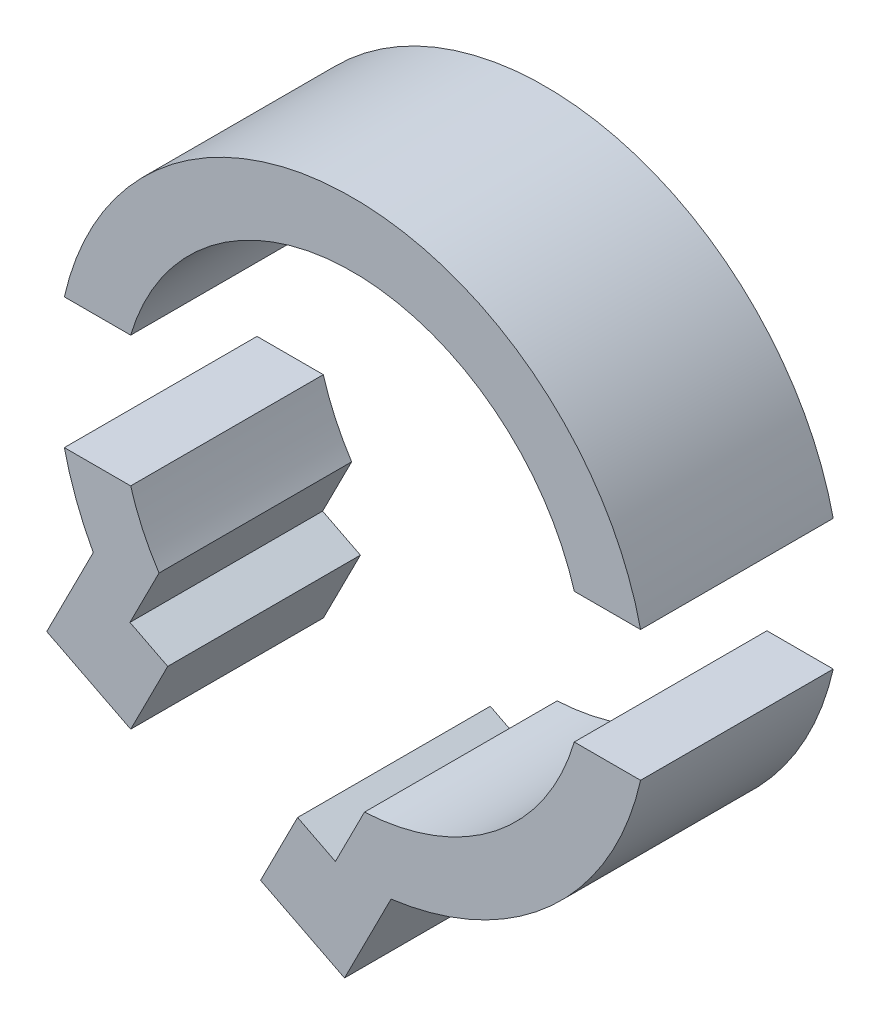
ISO-10303-21;
HEADER;
FILE_DESCRIPTION(('STEP AP214'),'2;1');
FILE_NAME('part.step','',(''),(''),'','','');
FILE_SCHEMA(('AUTOMOTIVE_DESIGN { 1 0 10303 214 1 1 1 1 }'));
ENDSEC;
DATA;
#1=APPLICATION_CONTEXT('core data for automotive mechanical design processes');
#2=APPLICATION_PROTOCOL_DEFINITION('international standard','automotive_design',2000,#1);
#3=PRODUCT_CONTEXT('',#1,'mechanical');
#4=PRODUCT('Part','Part','',(#3));
#5=PRODUCT_RELATED_PRODUCT_CATEGORY('part','',(#4));
#6=PRODUCT_DEFINITION_FORMATION('','',#4);
#7=PRODUCT_DEFINITION_CONTEXT('part definition',#1,'design');
#8=PRODUCT_DEFINITION('design','',#6,#7);
#9=PRODUCT_DEFINITION_SHAPE('','',#8);
#10=(LENGTH_UNIT() NAMED_UNIT(*) SI_UNIT(.MILLI.,.METRE.));
#11=(NAMED_UNIT(*) PLANE_ANGLE_UNIT() SI_UNIT($,.RADIAN.));
#12=(NAMED_UNIT(*) SI_UNIT($,.STERADIAN.) SOLID_ANGLE_UNIT());
#13=UNCERTAINTY_MEASURE_WITH_UNIT(LENGTH_MEASURE(1.E-05),#10,'distance_accuracy_value','');
#14=(GEOMETRIC_REPRESENTATION_CONTEXT(3) GLOBAL_UNCERTAINTY_ASSIGNED_CONTEXT((#13)) GLOBAL_UNIT_ASSIGNED_CONTEXT((#10,
#11,#12)) REPRESENTATION_CONTEXT('',''));
#15=CARTESIAN_POINT('',(0.,0.,0.));
#16=DIRECTION('',(0.,0.,1.));
#17=DIRECTION('',(1.,0.,0.));
#18=AXIS2_PLACEMENT_3D('',#15,#16,#17);
#19=CARTESIAN_POINT('',(-23.8013991895953,-18.1678851822026,15.));
#20=DIRECTION('',(0.452641250539144,0.89169271518296,0.));
#21=DIRECTION('',(-0.89169271518296,0.452641250539144,0.));
#22=AXIS2_PLACEMENT_3D('',#19,#20,#21);
#23=PLANE('',#22);
#24=DIRECTION('',(0.,0.,-1.));
#25=VECTOR('',#24,1.);
#26=CARTESIAN_POINT('',(-17.2652915873042,-21.4857455486545,21.));
#27=LINE('',#26,#25);
#28=CARTESIAN_POINT('',(-17.2652915873042,-21.4857455486545,15.));
#29=VERTEX_POINT('',#28);
#30=CARTESIAN_POINT('',(-17.2652915873042,-21.4857455486545,0.));
#31=VERTEX_POINT('',#30);
#32=EDGE_CURVE('E12',#29,#31,#27,.T.);
#33=ORIENTED_EDGE('',*,*,#32,.F.);
#34=DIRECTION('',(0.89169271518296,-0.452641250539144,0.));
#35=VECTOR('',#34,1.);
#36=CARTESIAN_POINT('',(-23.8013991895953,-18.1678851822026,15.));
#37=LINE('',#36,#35);
#38=CARTESIAN_POINT('',(-23.8013991895953,-18.1678851822026,15.));
#39=VERTEX_POINT('',#38);
#40=EDGE_CURVE('E143',#39,#29,#37,.T.);
#41=ORIENTED_EDGE('',*,*,#40,.F.);
#42=DIRECTION('',(0.,0.,-1.));
#43=VECTOR('',#42,1.);
#44=CARTESIAN_POINT('',(-23.8013991895953,-18.1678851822026,15.));
#45=LINE('',#44,#43);
#46=CARTESIAN_POINT('',(-23.8013991895953,-18.1678851822026,0.));
#47=VERTEX_POINT('',#46);
#48=EDGE_CURVE('E150',#39,#47,#45,.T.);
#49=ORIENTED_EDGE('',*,*,#48,.T.);
#50=DIRECTION('',(0.89169271518296,-0.452641250539144,0.));
#51=VECTOR('',#50,1.);
#52=CARTESIAN_POINT('',(-23.8013991895953,-18.1678851822026,0.));
#53=LINE('',#52,#51);
#54=EDGE_CURVE('E146',#47,#31,#53,.T.);
#55=ORIENTED_EDGE('',*,*,#54,.T.);
#56=EDGE_LOOP('',(#33,#41,#49,#55));
#57=FACE_BOUND('',#56,.T.);
#58=ADVANCED_FACE('F50',(#57),#23,.F.);
#59=CARTESIAN_POINT('',(0.,0.,0.));
#60=DIRECTION('',(0.,0.,1.));
#61=DIRECTION('',(1.,0.,0.));
#62=AXIS2_PLACEMENT_3D('',#59,#60,#61);
#63=PLANE('',#62);
#64=DIRECTION('',(-0.452641250539145,-0.89169271518296,0.));
#65=VECTOR('',#64,1.);
#66=CARTESIAN_POINT('',(-17.2652915873042,-21.4857455486545,0.));
#67=LINE('',#66,#65);
#68=CARTESIAN_POINT('',(-14.3829053131814,-15.8075117599372,0.));
#69=VERTEX_POINT('',#68);
#70=EDGE_CURVE('E149',#69,#31,#67,.T.);
#71=ORIENTED_EDGE('',*,*,#70,.T.);
#72=ORIENTED_EDGE('',*,*,#54,.F.);
#73=DIRECTION('',(-0.452641250539145,-0.89169271518296,0.));
#74=VECTOR('',#73,1.);
#75=CARTESIAN_POINT('',(-23.8013991895953,-18.1678851822026,0.));
#76=LINE('',#75,#74);
#77=CARTESIAN_POINT('',(-20.1802691852822,-11.0343434607389,0.));
#78=VERTEX_POINT('',#77);
#79=EDGE_CURVE('E172',#78,#47,#76,.T.);
#80=ORIENTED_EDGE('',*,*,#79,.F.);
#81=CARTESIAN_POINT('',(0.,0.,0.));
#82=DIRECTION('',(0.,0.,1.));
#83=DIRECTION('',(1.,0.,0.));
#84=AXIS2_PLACEMENT_3D('',#81,#82,#83);
#85=CIRCLE('',#84,23.);
#86=CARTESIAN_POINT('',(-22.4317131974113,-5.08116551876451,0.));
#87=VERTEX_POINT('',#86);
#88=EDGE_CURVE('E136',#87,#78,#85,.T.);
#89=ORIENTED_EDGE('',*,*,#88,.F.);
#90=DIRECTION('',(1.,0.,0.));
#91=VECTOR('',#90,1.);
#92=CARTESIAN_POINT('',(-27.3645817818939,-5.08116551876451,0.));
#93=LINE('',#92,#91);
#94=CARTESIAN_POINT('',(-17.2679401484635,-5.08116551876451,0.));
#95=VERTEX_POINT('',#94);
#96=EDGE_CURVE('E53',#87,#95,#93,.T.);
#97=ORIENTED_EDGE('',*,*,#96,.T.);
#98=CARTESIAN_POINT('',(0.,0.,0.));
#99=DIRECTION('',(0.,0.,1.));
#100=DIRECTION('',(1.,0.,0.));
#101=AXIS2_PLACEMENT_3D('',#98,#99,#100);
#102=CIRCLE('',#101,18.);
#103=CARTESIAN_POINT('',(-15.0622850205895,-9.85533205724319,0.));
#104=VERTEX_POINT('',#103);
#105=EDGE_CURVE('E127',#95,#104,#102,.T.);
#106=ORIENTED_EDGE('',*,*,#105,.T.);
#107=DIRECTION('',(-0.452641250539143,-0.891692715182961,0.));
#108=VECTOR('',#107,1.);
#109=CARTESIAN_POINT('',(-15.0622850205895,-9.85533205724319,0.));
#110=LINE('',#109,#108);
#111=CARTESIAN_POINT('',(-17.3254912732852,-14.313795633158,0.));
#112=VERTEX_POINT('',#111);
#113=EDGE_CURVE('E142',#104,#112,#110,.T.);
#114=ORIENTED_EDGE('',*,*,#113,.T.);
#115=DIRECTION('',(0.89169271518296,-0.452641250539144,0.));
#116=VECTOR('',#115,1.);
#117=CARTESIAN_POINT('',(-17.3254912732852,-14.313795633158,0.));
#118=LINE('',#117,#116);
#119=EDGE_CURVE('E145',#112,#69,#118,.T.);
#120=ORIENTED_EDGE('',*,*,#119,.T.);
#121=EDGE_LOOP('',(#71,#72,#80,#89,#97,#106,#114,#120));
#122=FACE_BOUND('',#121,.T.);
#123=ADVANCED_FACE('F202',(#122),#63,.F.);
#124=CARTESIAN_POINT('',(0.,0.,15.));
#125=DIRECTION('',(0.,0.,1.));
#126=DIRECTION('',(1.,0.,0.));
#127=AXIS2_PLACEMENT_3D('',#124,#125,#126);
#128=PLANE('',#127);
#129=ORIENTED_EDGE('',*,*,#40,.T.);
#130=DIRECTION('',(0.452641250539145,0.89169271518296,0.));
#131=VECTOR('',#130,1.);
#132=CARTESIAN_POINT('',(-5.05589769508736,2.56647589055694,15.));
#133=LINE('',#132,#131);
#134=CARTESIAN_POINT('',(-14.3829053131814,-15.8075117599372,15.));
#135=VERTEX_POINT('',#134);
#136=EDGE_CURVE('E65',#29,#135,#133,.T.);
#137=ORIENTED_EDGE('',*,*,#136,.T.);
#138=DIRECTION('',(-0.89169271518296,0.452641250539144,0.));
#139=VECTOR('',#138,1.);
#140=CARTESIAN_POINT('',(-9.32700761809406,-18.3739876504941,15.));
#141=LINE('',#140,#139);
#142=CARTESIAN_POINT('',(-17.3254912732852,-14.313795633158,15.));
#143=VERTEX_POINT('',#142);
#144=EDGE_CURVE('E151',#135,#143,#141,.T.);
#145=ORIENTED_EDGE('',*,*,#144,.T.);
#146=DIRECTION('',(0.452641250539143,0.891692715182961,0.));
#147=VECTOR('',#146,1.);
#148=CARTESIAN_POINT('',(-7.99848365519117,4.06019201733612,15.));
#149=LINE('',#148,#147);
#150=CARTESIAN_POINT('',(-15.0622850205895,-9.85533205724319,15.));
#151=VERTEX_POINT('',#150);
#152=EDGE_CURVE('E120',#143,#151,#149,.T.);
#153=ORIENTED_EDGE('',*,*,#152,.T.);
#154=CARTESIAN_POINT('',(0.,0.,15.));
#155=DIRECTION('',(0.,0.,1.));
#156=DIRECTION('',(1.,0.,0.));
#157=AXIS2_PLACEMENT_3D('',#154,#155,#156);
#158=CIRCLE('',#157,18.);
#159=CARTESIAN_POINT('',(-17.2679401484635,-5.08116551876451,15.));
#160=VERTEX_POINT('',#159);
#161=EDGE_CURVE('E125',#160,#151,#158,.T.);
#162=ORIENTED_EDGE('',*,*,#161,.F.);
#163=DIRECTION('',(-1.,0.,0.));
#164=VECTOR('',#163,1.);
#165=CARTESIAN_POINT('',(0.,-5.08116551876451,15.));
#166=LINE('',#165,#164);
#167=CARTESIAN_POINT('',(-22.4317131974114,-5.08116551876451,15.));
#168=VERTEX_POINT('',#167);
#169=EDGE_CURVE('E110',#160,#168,#166,.T.);
#170=ORIENTED_EDGE('',*,*,#169,.T.);
#171=CARTESIAN_POINT('',(0.,0.,15.));
#172=DIRECTION('',(0.,0.,1.));
#173=DIRECTION('',(1.,0.,0.));
#174=AXIS2_PLACEMENT_3D('',#171,#172,#173);
#175=CIRCLE('',#174,23.);
#176=CARTESIAN_POINT('',(-20.1802691852822,-11.0343434607389,15.));
#177=VERTEX_POINT('',#176);
#178=EDGE_CURVE('E119',#168,#177,#175,.T.);
#179=ORIENTED_EDGE('',*,*,#178,.T.);
#180=DIRECTION('',(-0.452641250539145,-0.89169271518296,0.));
#181=VECTOR('',#180,1.);
#182=CARTESIAN_POINT('',(-23.8013991895953,-18.1678851822026,15.));
#183=LINE('',#182,#181);
#184=EDGE_CURVE('E164',#177,#39,#183,.T.);
#185=ORIENTED_EDGE('',*,*,#184,.T.);
#186=EDGE_LOOP('',(#129,#137,#145,#153,#162,#170,#179,#185));
#187=FACE_BOUND('',#186,.T.);
#188=ADVANCED_FACE('F132',(#187),#128,.T.);
#189=CARTESIAN_POINT('',(-15.7408290647989,-18.4825899054861,21.));
#190=DIRECTION('',(0.891692715182961,-0.452641250539142,0.));
#191=DIRECTION('',(0.452641250539142,0.891692715182961,0.));
#192=AXIS2_PLACEMENT_3D('',#189,#190,#191);
#193=PLANE('',#192);
#194=DIRECTION('',(0.,0.,-1.));
#195=VECTOR('',#194,1.);
#196=CARTESIAN_POINT('',(-14.3829053131814,-15.8075117599372,21.));
#197=LINE('',#196,#195);
#198=EDGE_CURVE('E167',#135,#69,#197,.T.);
#199=ORIENTED_EDGE('',*,*,#198,.F.);
#200=ORIENTED_EDGE('',*,*,#136,.F.);
#201=ORIENTED_EDGE('',*,*,#32,.T.);
#202=ORIENTED_EDGE('',*,*,#70,.F.);
#203=EDGE_LOOP('',(#199,#200,#201,#202));
#204=FACE_BOUND('',#203,.T.);
#205=ADVANCED_FACE('F183',(#204),#193,.T.);
#206=CARTESIAN_POINT('',(-17.3254912732852,-14.313795633158,21.));
#207=DIRECTION('',(0.452641250539144,0.89169271518296,0.));
#208=DIRECTION('',(-0.89169271518296,0.452641250539144,0.));
#209=AXIS2_PLACEMENT_3D('',#206,#207,#208);
#210=PLANE('',#209);
#211=ORIENTED_EDGE('',*,*,#144,.F.);
#212=ORIENTED_EDGE('',*,*,#198,.T.);
#213=ORIENTED_EDGE('',*,*,#119,.F.);
#214=DIRECTION('',(0.,0.,-1.));
#215=VECTOR('',#214,1.);
#216=CARTESIAN_POINT('',(-17.3254912732852,-14.313795633158,21.));
#217=LINE('',#216,#215);
#218=EDGE_CURVE('E128',#143,#112,#217,.T.);
#219=ORIENTED_EDGE('',*,*,#218,.F.);
#220=EDGE_LOOP('',(#211,#212,#213,#219));
#221=FACE_BOUND('',#220,.T.);
#222=ADVANCED_FACE('F186',(#221),#210,.T.);
#223=CARTESIAN_POINT('',(-23.8013991895953,-18.1678851822026,15.));
#224=DIRECTION('',(0.89169271518296,-0.452641250539145,0.));
#225=DIRECTION('',(0.452641250539145,0.89169271518296,0.));
#226=AXIS2_PLACEMENT_3D('',#223,#224,#225);
#227=PLANE('',#226);
#228=ORIENTED_EDGE('',*,*,#79,.T.);
#229=ORIENTED_EDGE('',*,*,#48,.F.);
#230=ORIENTED_EDGE('',*,*,#184,.F.);
#231=DIRECTION('',(0.,0.,-1.));
#232=VECTOR('',#231,1.);
#233=CARTESIAN_POINT('',(-20.1802691852821,-11.0343434607389,15.));
#234=LINE('',#233,#232);
#235=EDGE_CURVE('E177',#177,#78,#234,.T.);
#236=ORIENTED_EDGE('',*,*,#235,.T.);
#237=EDGE_LOOP('',(#228,#229,#230,#236));
#238=FACE_BOUND('',#237,.T.);
#239=ADVANCED_FACE('F190',(#238),#227,.F.);
#240=CARTESIAN_POINT('',(-15.0622850205895,-9.85533205724319,21.));
#241=DIRECTION('',(0.891692715182961,-0.452641250539143,0.));
#242=DIRECTION('',(0.452641250539143,0.891692715182961,0.));
#243=AXIS2_PLACEMENT_3D('',#240,#241,#242);
#244=PLANE('',#243);
#245=ORIENTED_EDGE('',*,*,#218,.T.);
#246=ORIENTED_EDGE('',*,*,#113,.F.);
#247=DIRECTION('',(0.,0.,-1.));
#248=VECTOR('',#247,1.);
#249=CARTESIAN_POINT('',(-15.0622850205895,-9.85533205724319,15.));
#250=LINE('',#249,#248);
#251=EDGE_CURVE('E134',#151,#104,#250,.T.);
#252=ORIENTED_EDGE('',*,*,#251,.F.);
#253=ORIENTED_EDGE('',*,*,#152,.F.);
#254=EDGE_LOOP('',(#245,#246,#252,#253));
#255=FACE_BOUND('',#254,.T.);
#256=ADVANCED_FACE('F188',(#255),#244,.T.);
#257=CARTESIAN_POINT('',(0.,0.,15.));
#258=DIRECTION('',(0.,0.,-1.));
#259=DIRECTION('',(-1.,0.,0.));
#260=AXIS2_PLACEMENT_3D('',#257,#258,#259);
#261=CYLINDRICAL_SURFACE('',#260,18.);
#262=ORIENTED_EDGE('',*,*,#105,.F.);
#263=DIRECTION('',(0.,0.,-1.));
#264=VECTOR('',#263,1.);
#265=CARTESIAN_POINT('',(-17.2679401484635,-5.08116551876451,15.));
#266=LINE('',#265,#264);
#267=EDGE_CURVE('E113',#95,#160,#266,.F.);
#268=ORIENTED_EDGE('',*,*,#267,.T.);
#269=ORIENTED_EDGE('',*,*,#161,.T.);
#270=ORIENTED_EDGE('',*,*,#251,.T.);
#271=EDGE_LOOP('',(#262,#268,#269,#270));
#272=FACE_BOUND('',#271,.T.);
#273=ADVANCED_FACE('F123',(#272),#261,.F.);
#274=CARTESIAN_POINT('',(0.,0.,15.));
#275=DIRECTION('',(0.,0.,-1.));
#276=DIRECTION('',(-1.,0.,0.));
#277=AXIS2_PLACEMENT_3D('',#274,#275,#276);
#278=CYLINDRICAL_SURFACE('',#277,23.);
#279=DIRECTION('',(0.,0.,-1.));
#280=VECTOR('',#279,1.);
#281=CARTESIAN_POINT('',(-22.4317131974114,-5.08116551876451,15.));
#282=LINE('',#281,#280);
#283=EDGE_CURVE('E59',#87,#168,#282,.F.);
#284=ORIENTED_EDGE('',*,*,#283,.F.);
#285=ORIENTED_EDGE('',*,*,#88,.T.);
#286=ORIENTED_EDGE('',*,*,#235,.F.);
#287=ORIENTED_EDGE('',*,*,#178,.F.);
#288=EDGE_LOOP('',(#284,#285,#286,#287));
#289=FACE_BOUND('',#288,.T.);
#290=ADVANCED_FACE('F196',(#289),#278,.T.);
#291=CARTESIAN_POINT('',(-27.3645817818939,-5.08116551876451,21.));
#292=DIRECTION('',(0.,1.,0.));
#293=DIRECTION('',(-1.,0.,0.));
#294=AXIS2_PLACEMENT_3D('',#291,#292,#293);
#295=PLANE('',#294);
#296=ORIENTED_EDGE('',*,*,#283,.T.);
#297=ORIENTED_EDGE('',*,*,#169,.F.);
#298=ORIENTED_EDGE('',*,*,#267,.F.);
#299=ORIENTED_EDGE('',*,*,#96,.F.);
#300=EDGE_LOOP('',(#296,#297,#298,#299));
#301=FACE_BOUND('',#300,.T.);
#302=ADVANCED_FACE('F112',(#301),#295,.T.);
#303=CLOSED_SHELL('',(#58,#123,#188,#205,#222,#239,#256,#273,#290,#302));
#304=MANIFOLD_SOLID_BREP('B2',#303);
#305=CARTESIAN_POINT('',(0.,0.,15.));
#306=DIRECTION('',(0.,0.,1.));
#307=DIRECTION('',(1.,0.,0.));
#308=AXIS2_PLACEMENT_3D('',#305,#306,#307);
#309=PLANE('',#308);
#310=CARTESIAN_POINT('',(0.,0.,15.));
#311=DIRECTION('',(0.,0.,1.));
#312=DIRECTION('',(1.,0.,0.));
#313=AXIS2_PLACEMENT_3D('',#310,#311,#312);
#314=CIRCLE('',#313,23.);
#315=CARTESIAN_POINT('',(22.4317131974114,5.08116551876451,15.));
#316=VERTEX_POINT('',#315);
#317=CARTESIAN_POINT('',(-22.4317131974114,5.08116551876451,15.));
#318=VERTEX_POINT('',#317);
#319=EDGE_CURVE('E369',#316,#318,#314,.T.);
#320=ORIENTED_EDGE('',*,*,#319,.T.);
#321=DIRECTION('',(1.,0.,0.));
#322=VECTOR('',#321,1.);
#323=CARTESIAN_POINT('',(0.,5.08116551876451,15.));
#324=LINE('',#323,#322);
#325=CARTESIAN_POINT('',(-17.2679401484635,5.08116551876451,15.));
#326=VERTEX_POINT('',#325);
#327=EDGE_CURVE('E320',#318,#326,#324,.T.);
#328=ORIENTED_EDGE('',*,*,#327,.T.);
#329=CARTESIAN_POINT('',(0.,0.,15.));
#330=DIRECTION('',(0.,0.,1.));
#331=DIRECTION('',(1.,0.,0.));
#332=AXIS2_PLACEMENT_3D('',#329,#330,#331);
#333=CIRCLE('',#332,18.);
#334=CARTESIAN_POINT('',(17.2679401484635,5.08116551876451,15.));
#335=VERTEX_POINT('',#334);
#336=EDGE_CURVE('E356',#335,#326,#333,.T.);
#337=ORIENTED_EDGE('',*,*,#336,.F.);
#338=EDGE_CURVE('E341',#335,#316,#324,.T.);
#339=ORIENTED_EDGE('',*,*,#338,.T.);
#340=EDGE_LOOP('',(#320,#328,#337,#339));
#341=FACE_BOUND('',#340,.T.);
#342=ADVANCED_FACE('F302',(#341),#309,.T.);
#343=CARTESIAN_POINT('',(0.,0.,0.));
#344=DIRECTION('',(0.,0.,1.));
#345=DIRECTION('',(1.,0.,0.));
#346=AXIS2_PLACEMENT_3D('',#343,#344,#345);
#347=PLANE('',#346);
#348=DIRECTION('',(-1.,0.,0.));
#349=VECTOR('',#348,1.);
#350=CARTESIAN_POINT('',(-27.3645817818939,5.08116551876451,0.));
#351=LINE('',#350,#349);
#352=CARTESIAN_POINT('',(-17.2679401484635,5.08116551876451,0.));
#353=VERTEX_POINT('',#352);
#354=CARTESIAN_POINT('',(-22.4317131974113,5.08116551876451,0.));
#355=VERTEX_POINT('',#354);
#356=EDGE_CURVE('E349',#353,#355,#351,.T.);
#357=ORIENTED_EDGE('',*,*,#356,.T.);
#358=CARTESIAN_POINT('',(0.,0.,0.));
#359=DIRECTION('',(0.,0.,1.));
#360=DIRECTION('',(1.,0.,0.));
#361=AXIS2_PLACEMENT_3D('',#358,#359,#360);
#362=CIRCLE('',#361,23.);
#363=CARTESIAN_POINT('',(22.4317131974113,5.08116551876451,0.));
#364=VERTEX_POINT('',#363);
#365=EDGE_CURVE('E362',#364,#355,#362,.T.);
#366=ORIENTED_EDGE('',*,*,#365,.F.);
#367=CARTESIAN_POINT('',(17.2679401484635,5.08116551876451,0.));
#368=VERTEX_POINT('',#367);
#369=EDGE_CURVE('E374',#364,#368,#351,.T.);
#370=ORIENTED_EDGE('',*,*,#369,.T.);
#371=CARTESIAN_POINT('',(0.,0.,0.));
#372=DIRECTION('',(0.,0.,1.));
#373=DIRECTION('',(1.,0.,0.));
#374=AXIS2_PLACEMENT_3D('',#371,#372,#373);
#375=CIRCLE('',#374,18.);
#376=EDGE_CURVE('E305',#368,#353,#375,.T.);
#377=ORIENTED_EDGE('',*,*,#376,.T.);
#378=EDGE_LOOP('',(#357,#366,#370,#377));
#379=FACE_BOUND('',#378,.T.);
#380=ADVANCED_FACE('F382',(#379),#347,.F.);
#381=CARTESIAN_POINT('',(0.,0.,15.));
#382=DIRECTION('',(0.,0.,-1.));
#383=DIRECTION('',(-1.,0.,0.));
#384=AXIS2_PLACEMENT_3D('',#381,#382,#383);
#385=CYLINDRICAL_SURFACE('',#384,23.);
#386=DIRECTION('',(0.,0.,-1.));
#387=VECTOR('',#386,1.);
#388=CARTESIAN_POINT('',(-22.4317131974114,5.08116551876451,15.));
#389=LINE('',#388,#387);
#390=EDGE_CURVE('E48',#318,#355,#389,.T.);
#391=ORIENTED_EDGE('',*,*,#390,.F.);
#392=ORIENTED_EDGE('',*,*,#319,.F.);
#393=DIRECTION('',(0.,0.,-1.));
#394=VECTOR('',#393,1.);
#395=CARTESIAN_POINT('',(22.4317131974114,5.08116551876451,15.));
#396=LINE('',#395,#394);
#397=EDGE_CURVE('E312',#364,#316,#396,.F.);
#398=ORIENTED_EDGE('',*,*,#397,.F.);
#399=ORIENTED_EDGE('',*,*,#365,.T.);
#400=EDGE_LOOP('',(#391,#392,#398,#399));
#401=FACE_BOUND('',#400,.T.);
#402=ADVANCED_FACE('F385',(#401),#385,.T.);
#403=CARTESIAN_POINT('',(0.,0.,15.));
#404=DIRECTION('',(0.,0.,-1.));
#405=DIRECTION('',(-1.,0.,0.));
#406=AXIS2_PLACEMENT_3D('',#403,#404,#405);
#407=CYLINDRICAL_SURFACE('',#406,18.);
#408=ORIENTED_EDGE('',*,*,#336,.T.);
#409=DIRECTION('',(0.,0.,-1.));
#410=VECTOR('',#409,1.);
#411=CARTESIAN_POINT('',(-17.2679401484635,5.08116551876451,15.));
#412=LINE('',#411,#410);
#413=EDGE_CURVE('E359',#326,#353,#412,.T.);
#414=ORIENTED_EDGE('',*,*,#413,.T.);
#415=ORIENTED_EDGE('',*,*,#376,.F.);
#416=DIRECTION('',(0.,0.,-1.));
#417=VECTOR('',#416,1.);
#418=CARTESIAN_POINT('',(17.2679401484635,5.08116551876451,15.));
#419=LINE('',#418,#417);
#420=EDGE_CURVE('E338',#368,#335,#419,.F.);
#421=ORIENTED_EDGE('',*,*,#420,.T.);
#422=EDGE_LOOP('',(#408,#414,#415,#421));
#423=FACE_BOUND('',#422,.T.);
#424=ADVANCED_FACE('F354',(#423),#407,.F.);
#425=CARTESIAN_POINT('',(-27.3645817818939,5.08116551876451,21.));
#426=DIRECTION('',(0.,-1.,0.));
#427=DIRECTION('',(0.,0.,-1.));
#428=AXIS2_PLACEMENT_3D('',#425,#426,#427);
#429=PLANE('',#428);
#430=ORIENTED_EDGE('',*,*,#397,.T.);
#431=ORIENTED_EDGE('',*,*,#338,.F.);
#432=ORIENTED_EDGE('',*,*,#420,.F.);
#433=ORIENTED_EDGE('',*,*,#369,.F.);
#434=EDGE_LOOP('',(#430,#431,#432,#433));
#435=FACE_BOUND('',#434,.T.);
#436=ADVANCED_FACE('F342',(#435),#429,.T.);
#437=ORIENTED_EDGE('',*,*,#390,.T.);
#438=ORIENTED_EDGE('',*,*,#356,.F.);
#439=ORIENTED_EDGE('',*,*,#413,.F.);
#440=ORIENTED_EDGE('',*,*,#327,.F.);
#441=EDGE_LOOP('',(#437,#438,#439,#440));
#442=FACE_BOUND('',#441,.T.);
#443=ADVANCED_FACE('F383',(#442),#429,.T.);
#444=CLOSED_SHELL('',(#342,#380,#402,#424,#436,#443));
#445=MANIFOLD_SOLID_BREP('B6',#444);
#446=CARTESIAN_POINT('',(-17.3254912732852,-14.313795633158,21.));
#447=DIRECTION('',(0.452641250539144,0.89169271518296,0.));
#448=DIRECTION('',(-0.89169271518296,0.452641250539144,0.));
#449=AXIS2_PLACEMENT_3D('',#446,#447,#448);
#450=PLANE('',#449);
#451=DIRECTION('',(0.89169271518296,-0.452641250539144,0.));
#452=VECTOR('',#451,1.);
#453=CARTESIAN_POINT('',(-17.3254912732852,-14.313795633158,0.));
#454=LINE('',#453,#452);
#455=CARTESIAN_POINT('',(-4.27110992300667,-20.9404635410511,0.));
#456=VERTEX_POINT('',#455);
#457=CARTESIAN_POINT('',(-1.32852396290291,-22.4341796678302,0.));
#458=VERTEX_POINT('',#457);
#459=EDGE_CURVE('E563',#456,#458,#454,.T.);
#460=ORIENTED_EDGE('',*,*,#459,.F.);
#461=DIRECTION('',(0.,0.,1.));
#462=VECTOR('',#461,1.);
#463=CARTESIAN_POINT('',(-4.27110992300667,-20.9404635410511,21.));
#464=LINE('',#463,#462);
#465=CARTESIAN_POINT('',(-4.27110992300667,-20.9404635410511,15.));
#466=VERTEX_POINT('',#465);
#467=EDGE_CURVE('E455',#456,#466,#464,.T.);
#468=ORIENTED_EDGE('',*,*,#467,.T.);
#469=DIRECTION('',(-0.89169271518296,0.452641250539144,0.));
#470=VECTOR('',#469,1.);
#471=CARTESIAN_POINT('',(-9.32700761809406,-18.3739876504941,15.));
#472=LINE('',#471,#470);
#473=CARTESIAN_POINT('',(-1.32852396290291,-22.4341796678302,15.));
#474=VERTEX_POINT('',#473);
#475=EDGE_CURVE('E532',#474,#466,#472,.T.);
#476=ORIENTED_EDGE('',*,*,#475,.F.);
#477=DIRECTION('',(0.,0.,-1.));
#478=VECTOR('',#477,1.);
#479=CARTESIAN_POINT('',(-1.32852396290291,-22.4341796678302,21.));
#480=LINE('',#479,#478);
#481=EDGE_CURVE('E569',#474,#458,#480,.T.);
#482=ORIENTED_EDGE('',*,*,#481,.T.);
#483=EDGE_LOOP('',(#460,#468,#476,#482));
#484=FACE_BOUND('',#483,.T.);
#485=ADVANCED_FACE('F447',(#484),#450,.T.);
#486=CARTESIAN_POINT('',(-1.32852396290291,-22.4341796678302,21.));
#487=DIRECTION('',(-0.89169271518296,0.452641250539144,0.));
#488=DIRECTION('',(-0.452641250539144,-0.89169271518296,0.));
#489=AXIS2_PLACEMENT_3D('',#486,#487,#488);
#490=PLANE('',#489);
#491=DIRECTION('',(0.,0.,-1.));
#492=VECTOR('',#491,1.);
#493=CARTESIAN_POINT('',(0.93468228979281,-17.9757160919154,15.));
#494=LINE('',#493,#492);
#495=CARTESIAN_POINT('',(0.934682289792814,-17.9757160919154,0.));
#496=VERTEX_POINT('',#495);
#497=CARTESIAN_POINT('',(0.93468228979281,-17.9757160919154,15.));
#498=VERTEX_POINT('',#497);
#499=EDGE_CURVE('E556',#496,#498,#494,.F.);
#500=ORIENTED_EDGE('',*,*,#499,.F.);
#501=DIRECTION('',(0.452641250539144,0.89169271518296,0.));
#502=VECTOR('',#501,1.);
#503=CARTESIAN_POINT('',(-1.32852396290291,-22.4341796678302,0.));
#504=LINE('',#503,#502);
#505=EDGE_CURVE('E571',#458,#496,#504,.T.);
#506=ORIENTED_EDGE('',*,*,#505,.F.);
#507=ORIENTED_EDGE('',*,*,#481,.F.);
#508=DIRECTION('',(-0.452641250539144,-0.89169271518296,0.));
#509=VECTOR('',#508,1.);
#510=CARTESIAN_POINT('',(7.99848365519115,-4.06019201733612,15.));
#511=LINE('',#510,#509);
#512=EDGE_CURVE('E535',#498,#474,#511,.T.);
#513=ORIENTED_EDGE('',*,*,#512,.F.);
#514=EDGE_LOOP('',(#500,#506,#507,#513));
#515=FACE_BOUND('',#514,.T.);
#516=ADVANCED_FACE('F599',(#515),#490,.T.);
#517=CARTESIAN_POINT('',(0.,0.,15.));
#518=DIRECTION('',(0.,0.,-1.));
#519=DIRECTION('',(-1.,0.,0.));
#520=AXIS2_PLACEMENT_3D('',#517,#518,#519);
#521=CYLINDRICAL_SURFACE('',#520,18.);
#522=CARTESIAN_POINT('',(0.,0.,15.));
#523=DIRECTION('',(0.,0.,1.));
#524=DIRECTION('',(1.,0.,0.));
#525=AXIS2_PLACEMENT_3D('',#522,#523,#524);
#526=CIRCLE('',#525,18.);
#527=CARTESIAN_POINT('',(17.2679401484635,-5.08116551876451,15.));
#528=VERTEX_POINT('',#527);
#529=EDGE_CURVE('E547',#498,#528,#526,.T.);
#530=ORIENTED_EDGE('',*,*,#529,.T.);
#531=DIRECTION('',(0.,0.,-1.));
#532=VECTOR('',#531,1.);
#533=CARTESIAN_POINT('',(17.2679401484635,-5.08116551876451,15.));
#534=LINE('',#533,#532);
#535=CARTESIAN_POINT('',(17.2679401484635,-5.08116551876451,0.));
#536=VERTEX_POINT('',#535);
#537=EDGE_CURVE('E300',#528,#536,#534,.T.);
#538=ORIENTED_EDGE('',*,*,#537,.T.);
#539=CARTESIAN_POINT('',(0.,0.,0.));
#540=DIRECTION('',(0.,0.,1.));
#541=DIRECTION('',(1.,0.,0.));
#542=AXIS2_PLACEMENT_3D('',#539,#540,#541);
#543=CIRCLE('',#542,18.);
#544=EDGE_CURVE('E546',#496,#536,#543,.T.);
#545=ORIENTED_EDGE('',*,*,#544,.F.);
#546=ORIENTED_EDGE('',*,*,#499,.T.);
#547=EDGE_LOOP('',(#530,#538,#545,#546));
#548=FACE_BOUND('',#547,.T.);
#549=ADVANCED_FACE('F591',(#548),#521,.F.);
#550=CARTESIAN_POINT('',(-27.3645817818939,-5.08116551876451,21.));
#551=DIRECTION('',(0.,1.,0.));
#552=DIRECTION('',(-1.,0.,0.));
#553=AXIS2_PLACEMENT_3D('',#550,#551,#552);
#554=PLANE('',#553);
#555=DIRECTION('',(0.,0.,-1.));
#556=VECTOR('',#555,1.);
#557=CARTESIAN_POINT('',(22.4317131974114,-5.08116551876451,15.));
#558=LINE('',#557,#556);
#559=CARTESIAN_POINT('',(22.4317131974114,-5.08116551876451,15.));
#560=VERTEX_POINT('',#559);
#561=CARTESIAN_POINT('',(22.4317131974113,-5.08116551876451,0.));
#562=VERTEX_POINT('',#561);
#563=EDGE_CURVE('E519',#560,#562,#558,.T.);
#564=ORIENTED_EDGE('',*,*,#563,.T.);
#565=DIRECTION('',(1.,0.,0.));
#566=VECTOR('',#565,1.);
#567=CARTESIAN_POINT('',(-27.3645817818939,-5.08116551876451,0.));
#568=LINE('',#567,#566);
#569=EDGE_CURVE('E470',#536,#562,#568,.T.);
#570=ORIENTED_EDGE('',*,*,#569,.F.);
#571=ORIENTED_EDGE('',*,*,#537,.F.);
#572=DIRECTION('',(-1.,0.,0.));
#573=VECTOR('',#572,1.);
#574=CARTESIAN_POINT('',(0.,-5.08116551876451,15.));
#575=LINE('',#574,#573);
#576=EDGE_CURVE('E581',#560,#528,#575,.T.);
#577=ORIENTED_EDGE('',*,*,#576,.F.);
#578=EDGE_LOOP('',(#564,#570,#571,#577));
#579=FACE_BOUND('',#578,.T.);
#580=ADVANCED_FACE('F592',(#579),#554,.T.);
#581=CARTESIAN_POINT('',(0.,0.,15.));
#582=DIRECTION('',(0.,0.,-1.));
#583=DIRECTION('',(-1.,0.,0.));
#584=AXIS2_PLACEMENT_3D('',#581,#582,#583);
#585=CYLINDRICAL_SURFACE('',#584,23.);
#586=ORIENTED_EDGE('',*,*,#563,.F.);
#587=CARTESIAN_POINT('',(0.,0.,15.));
#588=DIRECTION('',(0.,0.,1.));
#589=DIRECTION('',(1.,0.,0.));
#590=AXIS2_PLACEMENT_3D('',#587,#588,#589);
#591=CIRCLE('',#590,23.);
#592=CARTESIAN_POINT('',(3.0037414094748,-22.8030159747566,15.));
#593=VERTEX_POINT('',#592);
#594=EDGE_CURVE('E553',#593,#560,#591,.T.);
#595=ORIENTED_EDGE('',*,*,#594,.F.);
#596=DIRECTION('',(0.,0.,-1.));
#597=VECTOR('',#596,1.);
#598=CARTESIAN_POINT('',(3.0037414094748,-22.8030159747566,15.));
#599=LINE('',#598,#597);
#600=CARTESIAN_POINT('',(3.0037414094748,-22.8030159747566,0.));
#601=VERTEX_POINT('',#600);
#602=EDGE_CURVE('E541',#593,#601,#599,.T.);
#603=ORIENTED_EDGE('',*,*,#602,.T.);
#604=CARTESIAN_POINT('',(0.,0.,0.));
#605=DIRECTION('',(0.,0.,1.));
#606=DIRECTION('',(1.,0.,0.));
#607=AXIS2_PLACEMENT_3D('',#604,#605,#606);
#608=CIRCLE('',#607,23.);
#609=EDGE_CURVE('E550',#601,#562,#608,.T.);
#610=ORIENTED_EDGE('',*,*,#609,.T.);
#611=EDGE_LOOP('',(#586,#595,#603,#610));
#612=FACE_BOUND('',#611,.T.);
#613=ADVANCED_FACE('F449',(#612),#585,.T.);
#614=CARTESIAN_POINT('',(-0.617388594838357,-29.9365576962203,15.));
#615=DIRECTION('',(-0.89169271518296,0.452641250539144,0.));
#616=DIRECTION('',(-0.452641250539144,-0.89169271518296,0.));
#617=AXIS2_PLACEMENT_3D('',#614,#615,#616);
#618=PLANE('',#617);
#619=DIRECTION('',(0.452641250539144,0.89169271518296,0.));
#620=VECTOR('',#619,1.);
#621=CARTESIAN_POINT('',(-0.617388594838357,-29.9365576962203,0.));
#622=LINE('',#621,#620);
#623=CARTESIAN_POINT('',(-0.617388594838357,-29.9365576962203,0.));
#624=VERTEX_POINT('',#623);
#625=EDGE_CURVE('E531',#624,#601,#622,.T.);
#626=ORIENTED_EDGE('',*,*,#625,.T.);
#627=ORIENTED_EDGE('',*,*,#602,.F.);
#628=DIRECTION('',(0.452641250539144,0.89169271518296,0.));
#629=VECTOR('',#628,1.);
#630=CARTESIAN_POINT('',(-0.617388594838357,-29.9365576962203,15.));
#631=LINE('',#630,#629);
#632=CARTESIAN_POINT('',(-0.617388594838357,-29.9365576962203,15.));
#633=VERTEX_POINT('',#632);
#634=EDGE_CURVE('E538',#633,#593,#631,.T.);
#635=ORIENTED_EDGE('',*,*,#634,.F.);
#636=DIRECTION('',(0.,0.,-1.));
#637=VECTOR('',#636,1.);
#638=CARTESIAN_POINT('',(-0.617388594838357,-29.9365576962203,15.));
#639=LINE('',#638,#637);
#640=EDGE_CURVE('E544',#633,#624,#639,.T.);
#641=ORIENTED_EDGE('',*,*,#640,.T.);
#642=EDGE_LOOP('',(#626,#627,#635,#641));
#643=FACE_BOUND('',#642,.T.);
#644=ADVANCED_FACE('F578',(#643),#618,.F.);
#645=CARTESIAN_POINT('',(0.,0.,15.));
#646=DIRECTION('',(0.,0.,1.));
#647=DIRECTION('',(1.,0.,0.));
#648=AXIS2_PLACEMENT_3D('',#645,#646,#647);
#649=PLANE('',#648);
#650=DIRECTION('',(-0.452641250539143,-0.891692715182961,0.));
#651=VECTOR('',#650,1.);
#652=CARTESIAN_POINT('',(5.05589769508737,-2.56647589055693,15.));
#653=LINE('',#652,#651);
#654=CARTESIAN_POINT('',(-7.15349619712946,-26.6186973297684,15.));
#655=VERTEX_POINT('',#654);
#656=EDGE_CURVE('E462',#466,#655,#653,.T.);
#657=ORIENTED_EDGE('',*,*,#656,.T.);
#658=DIRECTION('',(0.89169271518296,-0.452641250539144,0.));
#659=VECTOR('',#658,1.);
#660=CARTESIAN_POINT('',(-23.8013991895953,-18.1678851822026,15.));
#661=LINE('',#660,#659);
#662=EDGE_CURVE('E526',#655,#633,#661,.T.);
#663=ORIENTED_EDGE('',*,*,#662,.T.);
#664=ORIENTED_EDGE('',*,*,#634,.T.);
#665=ORIENTED_EDGE('',*,*,#594,.T.);
#666=ORIENTED_EDGE('',*,*,#576,.T.);
#667=ORIENTED_EDGE('',*,*,#529,.F.);
#668=ORIENTED_EDGE('',*,*,#512,.T.);
#669=ORIENTED_EDGE('',*,*,#475,.T.);
#670=EDGE_LOOP('',(#657,#663,#664,#665,#666,#667,#668,#669));
#671=FACE_BOUND('',#670,.T.);
#672=ADVANCED_FACE('F565',(#671),#649,.T.);
#673=CARTESIAN_POINT('',(0.,0.,0.));
#674=DIRECTION('',(0.,0.,1.));
#675=DIRECTION('',(1.,0.,0.));
#676=AXIS2_PLACEMENT_3D('',#673,#674,#675);
#677=PLANE('',#676);
#678=DIRECTION('',(0.89169271518296,-0.452641250539144,0.));
#679=VECTOR('',#678,1.);
#680=CARTESIAN_POINT('',(-23.8013991895953,-18.1678851822026,0.));
#681=LINE('',#680,#679);
#682=CARTESIAN_POINT('',(-7.15349619712945,-26.6186973297684,0.));
#683=VERTEX_POINT('',#682);
#684=EDGE_CURVE('E524',#683,#624,#681,.T.);
#685=ORIENTED_EDGE('',*,*,#684,.F.);
#686=DIRECTION('',(0.452641250539143,0.891692715182961,0.));
#687=VECTOR('',#686,1.);
#688=CARTESIAN_POINT('',(-4.27110992300667,-20.9404635410511,0.));
#689=LINE('',#688,#687);
#690=EDGE_CURVE('E510',#683,#456,#689,.T.);
#691=ORIENTED_EDGE('',*,*,#690,.T.);
#692=ORIENTED_EDGE('',*,*,#459,.T.);
#693=ORIENTED_EDGE('',*,*,#505,.T.);
#694=ORIENTED_EDGE('',*,*,#544,.T.);
#695=ORIENTED_EDGE('',*,*,#569,.T.);
#696=ORIENTED_EDGE('',*,*,#609,.F.);
#697=ORIENTED_EDGE('',*,*,#625,.F.);
#698=EDGE_LOOP('',(#685,#691,#692,#693,#694,#695,#696,#697));
#699=FACE_BOUND('',#698,.T.);
#700=ADVANCED_FACE('F529',(#699),#677,.F.);
#701=CARTESIAN_POINT('',(-23.8013991895953,-18.1678851822026,15.));
#702=DIRECTION('',(0.452641250539144,0.89169271518296,0.));
#703=DIRECTION('',(-0.89169271518296,0.452641250539144,0.));
#704=AXIS2_PLACEMENT_3D('',#701,#702,#703);
#705=PLANE('',#704);
#706=DIRECTION('',(0.,0.,-1.));
#707=VECTOR('',#706,1.);
#708=CARTESIAN_POINT('',(-7.15349619712945,-26.6186973297684,21.));
#709=LINE('',#708,#707);
#710=EDGE_CURVE('E513',#655,#683,#709,.T.);
#711=ORIENTED_EDGE('',*,*,#710,.T.);
#712=ORIENTED_EDGE('',*,*,#684,.T.);
#713=ORIENTED_EDGE('',*,*,#640,.F.);
#714=ORIENTED_EDGE('',*,*,#662,.F.);
#715=EDGE_LOOP('',(#711,#712,#713,#714));
#716=FACE_BOUND('',#715,.T.);
#717=ADVANCED_FACE('F522',(#716),#705,.F.);
#718=CARTESIAN_POINT('',(-4.27110992300667,-20.9404635410511,21.));
#719=DIRECTION('',(-0.891692715182961,0.452641250539143,0.));
#720=DIRECTION('',(-0.452641250539143,-0.891692715182961,0.));
#721=AXIS2_PLACEMENT_3D('',#718,#719,#720);
#722=PLANE('',#721);
#723=ORIENTED_EDGE('',*,*,#467,.F.);
#724=ORIENTED_EDGE('',*,*,#690,.F.);
#725=ORIENTED_EDGE('',*,*,#710,.F.);
#726=ORIENTED_EDGE('',*,*,#656,.F.);
#727=EDGE_LOOP('',(#723,#724,#725,#726));
#728=FACE_BOUND('',#727,.T.);
#729=ADVANCED_FACE('F512',(#728),#722,.T.);
#730=CLOSED_SHELL('',(#485,#516,#549,#580,#613,#644,#672,#700,#717,#729));
#731=MANIFOLD_SOLID_BREP('B42',#730);
#732=ADVANCED_BREP_SHAPE_REPRESENTATION('',(#18,#304,#445,#731),#14);
#733=SHAPE_DEFINITION_REPRESENTATION(#9,#732);
ENDSEC;
END-ISO-10303-21;
